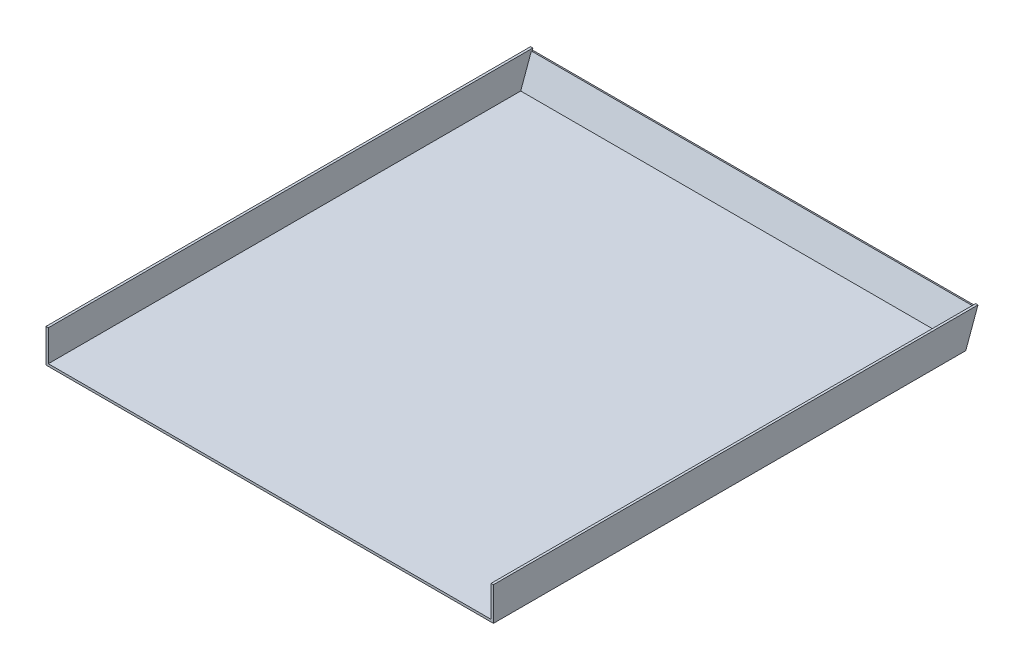
ISO-10303-21;
HEADER;
FILE_DESCRIPTION(('STEP AP214'),'2;1');
FILE_NAME('part.step','',(''),(''),'','','');
FILE_SCHEMA(('AUTOMOTIVE_DESIGN { 1 0 10303 214 1 1 1 1 }'));
ENDSEC;
DATA;
#1=APPLICATION_CONTEXT('core data for automotive mechanical design processes');
#2=APPLICATION_PROTOCOL_DEFINITION('international standard','automotive_design',2000,#1);
#3=PRODUCT_CONTEXT('',#1,'mechanical');
#4=PRODUCT('Part','Part','',(#3));
#5=PRODUCT_RELATED_PRODUCT_CATEGORY('part','',(#4));
#6=PRODUCT_DEFINITION_FORMATION('','',#4);
#7=PRODUCT_DEFINITION_CONTEXT('part definition',#1,'design');
#8=PRODUCT_DEFINITION('design','',#6,#7);
#9=PRODUCT_DEFINITION_SHAPE('','',#8);
#10=(LENGTH_UNIT() NAMED_UNIT(*) SI_UNIT(.MILLI.,.METRE.));
#11=(NAMED_UNIT(*) PLANE_ANGLE_UNIT() SI_UNIT($,.RADIAN.));
#12=(NAMED_UNIT(*) SI_UNIT($,.STERADIAN.) SOLID_ANGLE_UNIT());
#13=UNCERTAINTY_MEASURE_WITH_UNIT(LENGTH_MEASURE(1.E-05),#10,'distance_accuracy_value','');
#14=(GEOMETRIC_REPRESENTATION_CONTEXT(3) GLOBAL_UNCERTAINTY_ASSIGNED_CONTEXT((#13)) GLOBAL_UNIT_ASSIGNED_CONTEXT((#10,
#11,#12)) REPRESENTATION_CONTEXT('',''));
#15=CARTESIAN_POINT('',(0.,0.,0.));
#16=DIRECTION('',(0.,0.,1.));
#17=DIRECTION('',(1.,0.,0.));
#18=AXIS2_PLACEMENT_3D('',#15,#16,#17);
#19=CARTESIAN_POINT('',(-142.,21.5,-151.5));
#20=DIRECTION('',(-1.,0.,0.));
#21=DIRECTION('',(0.,0.,1.));
#22=AXIS2_PLACEMENT_3D('',#19,#20,#21);
#23=PLANE('',#22);
#24=DIRECTION('',(0.,0.342020143325665,0.93969262078591));
#25=VECTOR('',#24,1.);
#26=CARTESIAN_POINT('',(-142.,20.2938524157182,-158.340402866513));
#27=LINE('',#26,#25);
#28=CARTESIAN_POINT('',(-142.,20.1183857480574,-158.822493573778));
#29=VERTEX_POINT('',#28);
#30=CARTESIAN_POINT('',(-142.,20.2938524157182,-158.340402866513));
#31=VERTEX_POINT('',#30);
#32=EDGE_CURVE('E160',#29,#31,#27,.T.);
#33=ORIENTED_EDGE('',*,*,#32,.F.);
#34=DIRECTION('',(0.,0.939692620785911,-0.342020143325663));
#35=VECTOR('',#34,1.);
#36=CARTESIAN_POINT('',(-142.,21.5,-159.325360036723));
#37=LINE('',#36,#35);
#38=CARTESIAN_POINT('',(-142.,21.5,-159.325360036723));
#39=VERTEX_POINT('',#38);
#40=EDGE_CURVE('E211',#29,#39,#37,.T.);
#41=ORIENTED_EDGE('',*,*,#40,.T.);
#42=DIRECTION('',(0.,0.,-1.));
#43=VECTOR('',#42,1.);
#44=CARTESIAN_POINT('',(-142.,21.5,-151.5));
#45=LINE('',#44,#43);
#46=CARTESIAN_POINT('',(-142.,21.5,151.5));
#47=VERTEX_POINT('',#46);
#48=EDGE_CURVE('E244',#47,#39,#45,.T.);
#49=ORIENTED_EDGE('',*,*,#48,.F.);
#50=DIRECTION('',(0.,-1.,0.));
#51=VECTOR('',#50,1.);
#52=CARTESIAN_POINT('',(-142.,21.5,151.5));
#53=LINE('',#52,#51);
#54=CARTESIAN_POINT('',(-142.,1.5,151.5));
#55=VERTEX_POINT('',#54);
#56=EDGE_CURVE('E248',#47,#55,#53,.T.);
#57=ORIENTED_EDGE('',*,*,#56,.T.);
#58=DIRECTION('',(0.,0.,-1.));
#59=VECTOR('',#58,1.);
#60=CARTESIAN_POINT('',(-142.,1.5,-151.5));
#61=LINE('',#60,#59);
#62=CARTESIAN_POINT('',(-142.,1.5,-151.5));
#63=VERTEX_POINT('',#62);
#64=EDGE_CURVE('E236',#55,#63,#61,.T.);
#65=ORIENTED_EDGE('',*,*,#64,.T.);
#66=DIRECTION('',(0.,-0.93969262078591,0.342020143325665));
#67=VECTOR('',#66,1.);
#68=CARTESIAN_POINT('',(-142.,1.5,-151.5));
#69=LINE('',#68,#67);
#70=EDGE_CURVE('E55',#31,#63,#69,.T.);
#71=ORIENTED_EDGE('',*,*,#70,.F.);
#72=EDGE_LOOP('',(#33,#41,#49,#57,#65,#71));
#73=FACE_BOUND('',#72,.T.);
#74=ADVANCED_FACE('F39',(#73),#23,.F.);
#75=CARTESIAN_POINT('',(142.,21.5,-151.5));
#76=DIRECTION('',(1.,0.,0.));
#77=DIRECTION('',(0.,0.,-1.));
#78=AXIS2_PLACEMENT_3D('',#75,#76,#77);
#79=PLANE('',#78);
#80=DIRECTION('',(0.,0.342020143325665,0.93969262078591));
#81=VECTOR('',#80,1.);
#82=CARTESIAN_POINT('',(142.,20.2938524157182,-158.340402866513));
#83=LINE('',#82,#81);
#84=CARTESIAN_POINT('',(142.,20.1183857480575,-158.822493573778));
#85=VERTEX_POINT('',#84);
#86=CARTESIAN_POINT('',(142.,20.2938524157182,-158.340402866513));
#87=VERTEX_POINT('',#86);
#88=EDGE_CURVE('E63',#85,#87,#83,.T.);
#89=ORIENTED_EDGE('',*,*,#88,.T.);
#90=DIRECTION('',(0.,-0.93969262078591,0.342020143325665));
#91=VECTOR('',#90,1.);
#92=CARTESIAN_POINT('',(142.,1.5,-151.5));
#93=LINE('',#92,#91);
#94=CARTESIAN_POINT('',(142.,1.5,-151.5));
#95=VERTEX_POINT('',#94);
#96=EDGE_CURVE('E182',#87,#95,#93,.T.);
#97=ORIENTED_EDGE('',*,*,#96,.T.);
#98=DIRECTION('',(0.,0.,1.));
#99=VECTOR('',#98,1.);
#100=CARTESIAN_POINT('',(142.,1.5,-151.5));
#101=LINE('',#100,#99);
#102=CARTESIAN_POINT('',(142.,1.5,151.5));
#103=VERTEX_POINT('',#102);
#104=EDGE_CURVE('E210',#95,#103,#101,.T.);
#105=ORIENTED_EDGE('',*,*,#104,.T.);
#106=DIRECTION('',(0.,-1.,0.));
#107=VECTOR('',#106,1.);
#108=CARTESIAN_POINT('',(142.,21.5,151.5));
#109=LINE('',#108,#107);
#110=CARTESIAN_POINT('',(142.,21.5,151.5));
#111=VERTEX_POINT('',#110);
#112=EDGE_CURVE('E229',#111,#103,#109,.T.);
#113=ORIENTED_EDGE('',*,*,#112,.F.);
#114=DIRECTION('',(0.,0.,1.));
#115=VECTOR('',#114,1.);
#116=CARTESIAN_POINT('',(142.,21.5,-151.5));
#117=LINE('',#116,#115);
#118=CARTESIAN_POINT('',(142.,21.5,-159.325360036723));
#119=VERTEX_POINT('',#118);
#120=EDGE_CURVE('E222',#119,#111,#117,.T.);
#121=ORIENTED_EDGE('',*,*,#120,.F.);
#122=DIRECTION('',(0.,-0.939692620785911,0.342020143325662));
#123=VECTOR('',#122,1.);
#124=CARTESIAN_POINT('',(142.,21.5,-159.325360036723));
#125=LINE('',#124,#123);
#126=EDGE_CURVE('E191',#119,#85,#125,.T.);
#127=ORIENTED_EDGE('',*,*,#126,.T.);
#128=EDGE_LOOP('',(#89,#97,#105,#113,#121,#127));
#129=FACE_BOUND('',#128,.T.);
#130=ADVANCED_FACE('F308',(#129),#79,.F.);
#131=CARTESIAN_POINT('',(0.,1.5,0.));
#132=DIRECTION('',(0.,1.,0.));
#133=DIRECTION('',(0.,0.,1.));
#134=AXIS2_PLACEMENT_3D('',#131,#132,#133);
#135=PLANE('',#134);
#136=DIRECTION('',(1.,0.,0.));
#137=VECTOR('',#136,1.);
#138=CARTESIAN_POINT('',(-143.5,1.5,151.5));
#139=LINE('',#138,#137);
#140=EDGE_CURVE('E255',#55,#103,#139,.T.);
#141=ORIENTED_EDGE('',*,*,#140,.T.);
#142=ORIENTED_EDGE('',*,*,#104,.F.);
#143=DIRECTION('',(1.,0.,0.));
#144=VECTOR('',#143,1.);
#145=CARTESIAN_POINT('',(-143.5,1.5,-151.5));
#146=LINE('',#145,#144);
#147=EDGE_CURVE('E258',#63,#95,#146,.T.);
#148=ORIENTED_EDGE('',*,*,#147,.F.);
#149=ORIENTED_EDGE('',*,*,#64,.F.);
#150=EDGE_LOOP('',(#141,#142,#148,#149));
#151=FACE_BOUND('',#150,.T.);
#152=ADVANCED_FACE('F311',(#151),#135,.T.);
#153=CARTESIAN_POINT('',(-143.5,1.5,151.5));
#154=DIRECTION('',(0.,0.,-1.));
#155=DIRECTION('',(-1.,0.,0.));
#156=AXIS2_PLACEMENT_3D('',#153,#154,#155);
#157=PLANE('',#156);
#158=DIRECTION('',(1.,0.,0.));
#159=VECTOR('',#158,1.);
#160=CARTESIAN_POINT('',(-143.5,0.,151.5));
#161=LINE('',#160,#159);
#162=CARTESIAN_POINT('',(-143.5,0.,151.5));
#163=VERTEX_POINT('',#162);
#164=CARTESIAN_POINT('',(143.5,0.,151.5));
#165=VERTEX_POINT('',#164);
#166=EDGE_CURVE('E254',#163,#165,#161,.T.);
#167=ORIENTED_EDGE('',*,*,#166,.T.);
#168=DIRECTION('',(0.,-1.,0.));
#169=VECTOR('',#168,1.);
#170=CARTESIAN_POINT('',(143.5,1.5,151.5));
#171=LINE('',#170,#169);
#172=CARTESIAN_POINT('',(143.5,21.5,151.5));
#173=VERTEX_POINT('',#172);
#174=EDGE_CURVE('E11',#173,#165,#171,.T.);
#175=ORIENTED_EDGE('',*,*,#174,.F.);
#176=DIRECTION('',(1.,0.,0.));
#177=VECTOR('',#176,1.);
#178=CARTESIAN_POINT('',(143.5,21.5,151.5));
#179=LINE('',#178,#177);
#180=EDGE_CURVE('E225',#111,#173,#179,.T.);
#181=ORIENTED_EDGE('',*,*,#180,.F.);
#182=ORIENTED_EDGE('',*,*,#112,.T.);
#183=ORIENTED_EDGE('',*,*,#140,.F.);
#184=ORIENTED_EDGE('',*,*,#56,.F.);
#185=DIRECTION('',(1.,0.,0.));
#186=VECTOR('',#185,1.);
#187=CARTESIAN_POINT('',(-143.5,21.5,151.5));
#188=LINE('',#187,#186);
#189=CARTESIAN_POINT('',(-143.5,21.5,151.5));
#190=VERTEX_POINT('',#189);
#191=EDGE_CURVE('E241',#190,#47,#188,.T.);
#192=ORIENTED_EDGE('',*,*,#191,.F.);
#193=DIRECTION('',(0.,-1.,0.));
#194=VECTOR('',#193,1.);
#195=CARTESIAN_POINT('',(-143.5,1.5,151.5));
#196=LINE('',#195,#194);
#197=EDGE_CURVE('E48',#190,#163,#196,.T.);
#198=ORIENTED_EDGE('',*,*,#197,.T.);
#199=EDGE_LOOP('',(#167,#175,#181,#182,#183,#184,#192,#198));
#200=FACE_BOUND('',#199,.T.);
#201=ADVANCED_FACE('F41',(#200),#157,.F.);
#202=CARTESIAN_POINT('',(143.5,1.5,151.5));
#203=DIRECTION('',(-1.,0.,0.));
#204=DIRECTION('',(0.,0.,1.));
#205=AXIS2_PLACEMENT_3D('',#202,#203,#204);
#206=PLANE('',#205);
#207=DIRECTION('',(0.,0.,-1.));
#208=VECTOR('',#207,1.);
#209=CARTESIAN_POINT('',(143.5,0.,151.5));
#210=LINE('',#209,#208);
#211=CARTESIAN_POINT('',(143.5,0.,-151.5));
#212=VERTEX_POINT('',#211);
#213=EDGE_CURVE('E266',#165,#212,#210,.T.);
#214=ORIENTED_EDGE('',*,*,#213,.T.);
#215=DIRECTION('',(0.,0.939692620785911,-0.342020143325662));
#216=VECTOR('',#215,1.);
#217=CARTESIAN_POINT('',(143.5,21.5,-159.325360036723));
#218=LINE('',#217,#216);
#219=CARTESIAN_POINT('',(143.5,21.5,-159.325360036723));
#220=VERTEX_POINT('',#219);
#221=EDGE_CURVE('E176',#212,#220,#218,.T.);
#222=ORIENTED_EDGE('',*,*,#221,.T.);
#223=DIRECTION('',(0.,0.,-1.));
#224=VECTOR('',#223,1.);
#225=CARTESIAN_POINT('',(143.5,21.5,-151.5));
#226=LINE('',#225,#224);
#227=EDGE_CURVE('E219',#173,#220,#226,.T.);
#228=ORIENTED_EDGE('',*,*,#227,.F.);
#229=ORIENTED_EDGE('',*,*,#174,.T.);
#230=EDGE_LOOP('',(#214,#222,#228,#229));
#231=FACE_BOUND('',#230,.T.);
#232=ADVANCED_FACE('F340',(#231),#206,.F.);
#233=CARTESIAN_POINT('',(-143.5,1.5,151.5));
#234=DIRECTION('',(-1.,0.,0.));
#235=DIRECTION('',(0.,0.,1.));
#236=AXIS2_PLACEMENT_3D('',#233,#234,#235);
#237=PLANE('',#236);
#238=DIRECTION('',(0.,0.,-1.));
#239=VECTOR('',#238,1.);
#240=CARTESIAN_POINT('',(-143.5,0.,151.5));
#241=LINE('',#240,#239);
#242=CARTESIAN_POINT('',(-143.5,0.,-151.5));
#243=VERTEX_POINT('',#242);
#244=EDGE_CURVE('E259',#163,#243,#241,.T.);
#245=ORIENTED_EDGE('',*,*,#244,.F.);
#246=ORIENTED_EDGE('',*,*,#197,.F.);
#247=DIRECTION('',(0.,0.,1.));
#248=VECTOR('',#247,1.);
#249=CARTESIAN_POINT('',(-143.5,21.5,-151.5));
#250=LINE('',#249,#248);
#251=CARTESIAN_POINT('',(-143.5,21.5,-159.325360036723));
#252=VERTEX_POINT('',#251);
#253=EDGE_CURVE('E237',#252,#190,#250,.T.);
#254=ORIENTED_EDGE('',*,*,#253,.F.);
#255=DIRECTION('',(0.,-0.93969262078591,0.342020143325663));
#256=VECTOR('',#255,1.);
#257=CARTESIAN_POINT('',(-143.5,21.5,-159.325360036723));
#258=LINE('',#257,#256);
#259=EDGE_CURVE('E194',#252,#243,#258,.T.);
#260=ORIENTED_EDGE('',*,*,#259,.T.);
#261=EDGE_LOOP('',(#245,#246,#254,#260));
#262=FACE_BOUND('',#261,.T.);
#263=ADVANCED_FACE('F284',(#262),#237,.T.);
#264=CARTESIAN_POINT('',(0.,0.,0.));
#265=DIRECTION('',(0.,1.,0.));
#266=DIRECTION('',(0.,0.,1.));
#267=AXIS2_PLACEMENT_3D('',#264,#265,#266);
#268=PLANE('',#267);
#269=ORIENTED_EDGE('',*,*,#166,.F.);
#270=ORIENTED_EDGE('',*,*,#244,.T.);
#271=DIRECTION('',(1.,0.,0.));
#272=VECTOR('',#271,1.);
#273=CARTESIAN_POINT('',(-143.5,0.,-151.5));
#274=LINE('',#273,#272);
#275=CARTESIAN_POINT('',(-142.,0.,-151.5));
#276=VERTEX_POINT('',#275);
#277=EDGE_CURVE('E270',#243,#276,#274,.T.);
#278=ORIENTED_EDGE('',*,*,#277,.T.);
#279=CARTESIAN_POINT('',(142.,0.,-151.5));
#280=VERTEX_POINT('',#279);
#281=EDGE_CURVE('E164',#276,#280,#274,.T.);
#282=ORIENTED_EDGE('',*,*,#281,.T.);
#283=DIRECTION('',(1.,0.,0.));
#284=VECTOR('',#283,1.);
#285=CARTESIAN_POINT('',(119.120177891768,0.,-151.5));
#286=LINE('',#285,#284);
#287=EDGE_CURVE('E200',#280,#212,#286,.T.);
#288=ORIENTED_EDGE('',*,*,#287,.T.);
#289=ORIENTED_EDGE('',*,*,#213,.F.);
#290=EDGE_LOOP('',(#269,#270,#278,#282,#288,#289));
#291=FACE_BOUND('',#290,.T.);
#292=ADVANCED_FACE('F282',(#291),#268,.F.);
#293=CARTESIAN_POINT('',(0.,21.5,0.));
#294=DIRECTION('',(0.,1.,0.));
#295=DIRECTION('',(0.,0.,1.));
#296=AXIS2_PLACEMENT_3D('',#293,#294,#295);
#297=PLANE('',#296);
#298=ORIENTED_EDGE('',*,*,#253,.T.);
#299=ORIENTED_EDGE('',*,*,#191,.T.);
#300=ORIENTED_EDGE('',*,*,#48,.T.);
#301=DIRECTION('',(-1.,0.,0.));
#302=VECTOR('',#301,1.);
#303=CARTESIAN_POINT('',(-119.120177891768,21.5,-159.325360036723));
#304=LINE('',#303,#302);
#305=EDGE_CURVE('E215',#39,#252,#304,.T.);
#306=ORIENTED_EDGE('',*,*,#305,.T.);
#307=EDGE_LOOP('',(#298,#299,#300,#306));
#308=FACE_BOUND('',#307,.T.);
#309=ADVANCED_FACE('F316',(#308),#297,.T.);
#310=CARTESIAN_POINT('',(0.,21.5,0.));
#311=DIRECTION('',(0.,-1.,0.));
#312=DIRECTION('',(0.,0.,-1.));
#313=AXIS2_PLACEMENT_3D('',#310,#311,#312);
#314=PLANE('',#313);
#315=ORIENTED_EDGE('',*,*,#227,.T.);
#316=DIRECTION('',(1.,0.,0.));
#317=VECTOR('',#316,1.);
#318=CARTESIAN_POINT('',(119.120177891768,21.5,-159.325360036723));
#319=LINE('',#318,#317);
#320=EDGE_CURVE('E199',#119,#220,#319,.T.);
#321=ORIENTED_EDGE('',*,*,#320,.F.);
#322=ORIENTED_EDGE('',*,*,#120,.T.);
#323=ORIENTED_EDGE('',*,*,#180,.T.);
#324=EDGE_LOOP('',(#315,#321,#322,#323));
#325=FACE_BOUND('',#324,.T.);
#326=ADVANCED_FACE('F318',(#325),#314,.F.);
#327=CARTESIAN_POINT('',(-119.120177891768,21.5,-159.325360036723));
#328=DIRECTION('',(0.,-0.342020143325663,-0.93969262078591));
#329=DIRECTION('',(0.,0.939692620785911,-0.342020143325663));
#330=AXIS2_PLACEMENT_3D('',#327,#328,#329);
#331=PLANE('',#330);
#332=EDGE_CURVE('E207',#276,#29,#37,.T.);
#333=ORIENTED_EDGE('',*,*,#332,.F.);
#334=ORIENTED_EDGE('',*,*,#277,.F.);
#335=ORIENTED_EDGE('',*,*,#259,.F.);
#336=ORIENTED_EDGE('',*,*,#305,.F.);
#337=ORIENTED_EDGE('',*,*,#40,.F.);
#338=EDGE_LOOP('',(#333,#334,#335,#336,#337));
#339=FACE_BOUND('',#338,.T.);
#340=ADVANCED_FACE('F289',(#339),#331,.T.);
#341=CARTESIAN_POINT('',(119.120177891768,21.5,-159.325360036723));
#342=DIRECTION('',(0.,-0.342020143325662,-0.939692620785911));
#343=DIRECTION('',(0.,0.939692620785911,-0.342020143325662));
#344=AXIS2_PLACEMENT_3D('',#341,#342,#343);
#345=PLANE('',#344);
#346=ORIENTED_EDGE('',*,*,#126,.F.);
#347=ORIENTED_EDGE('',*,*,#320,.T.);
#348=ORIENTED_EDGE('',*,*,#221,.F.);
#349=ORIENTED_EDGE('',*,*,#287,.F.);
#350=EDGE_CURVE('E195',#85,#280,#125,.T.);
#351=ORIENTED_EDGE('',*,*,#350,.F.);
#352=EDGE_LOOP('',(#346,#347,#348,#349,#351));
#353=FACE_BOUND('',#352,.T.);
#354=ADVANCED_FACE('F296',(#353),#345,.T.);
#355=CARTESIAN_POINT('',(163.90666532214,1.5,-151.5));
#356=DIRECTION('',(-1.,0.,0.));
#357=DIRECTION('',(0.,0.,1.));
#358=AXIS2_PLACEMENT_3D('',#355,#356,#357);
#359=CYLINDRICAL_SURFACE('',#358,1.50000000000001);
#360=CARTESIAN_POINT('',(142.,1.5,-151.5));
#361=DIRECTION('',(1.,0.,0.));
#362=DIRECTION('',(0.,0.,-1.));
#363=AXIS2_PLACEMENT_3D('',#360,#361,#362);
#364=CIRCLE('',#363,1.50000000000001);
#365=CARTESIAN_POINT('',(142.,0.986969785011504,-152.909538931179));
#366=VERTEX_POINT('',#365);
#367=EDGE_CURVE('E179',#280,#366,#364,.T.);
#368=ORIENTED_EDGE('',*,*,#367,.F.);
#369=ORIENTED_EDGE('',*,*,#281,.F.);
#370=CARTESIAN_POINT('',(-142.,1.5,-151.5));
#371=DIRECTION('',(-1.,0.,0.));
#372=DIRECTION('',(0.,0.,1.));
#373=AXIS2_PLACEMENT_3D('',#370,#371,#372);
#374=CIRCLE('',#373,1.50000000000001);
#375=CARTESIAN_POINT('',(-142.,0.986969785011504,-152.909538931179));
#376=VERTEX_POINT('',#375);
#377=EDGE_CURVE('E156',#276,#376,#374,.F.);
#378=ORIENTED_EDGE('',*,*,#377,.T.);
#379=DIRECTION('',(-1.,0.,0.));
#380=VECTOR('',#379,1.);
#381=CARTESIAN_POINT('',(163.90666532214,0.986969785011504,-152.909538931179));
#382=LINE('',#381,#380);
#383=EDGE_CURVE('E137',#366,#376,#382,.T.);
#384=ORIENTED_EDGE('',*,*,#383,.F.);
#385=EDGE_LOOP('',(#368,#369,#378,#384));
#386=FACE_BOUND('',#385,.T.);
#387=ADVANCED_FACE('F163',(#386),#359,.T.);
#388=CARTESIAN_POINT('',(163.90666532214,19.7808222007297,-159.749941797692));
#389=DIRECTION('',(0.,0.342020143325665,0.93969262078591));
#390=DIRECTION('',(0.,-0.93969262078591,0.342020143325665));
#391=AXIS2_PLACEMENT_3D('',#388,#389,#390);
#392=PLANE('',#391);
#393=DIRECTION('',(0.,0.93969262078591,-0.342020143325665));
#394=VECTOR('',#393,1.);
#395=CARTESIAN_POINT('',(142.,19.7808222007297,-159.749941797692));
#396=LINE('',#395,#394);
#397=CARTESIAN_POINT('',(142.,19.7808222007297,-159.749941797692));
#398=VERTEX_POINT('',#397);
#399=EDGE_CURVE('E143',#366,#398,#396,.T.);
#400=ORIENTED_EDGE('',*,*,#399,.F.);
#401=ORIENTED_EDGE('',*,*,#383,.T.);
#402=DIRECTION('',(0.,0.93969262078591,-0.342020143325665));
#403=VECTOR('',#402,1.);
#404=CARTESIAN_POINT('',(-142.,19.7808222007297,-159.749941797692));
#405=LINE('',#404,#403);
#406=CARTESIAN_POINT('',(-142.,19.7808222007297,-159.749941797692));
#407=VERTEX_POINT('',#406);
#408=EDGE_CURVE('E141',#376,#407,#405,.T.);
#409=ORIENTED_EDGE('',*,*,#408,.T.);
#410=DIRECTION('',(-1.,0.,0.));
#411=VECTOR('',#410,1.);
#412=CARTESIAN_POINT('',(163.90666532214,19.7808222007297,-159.749941797692));
#413=LINE('',#412,#411);
#414=EDGE_CURVE('E149',#398,#407,#413,.T.);
#415=ORIENTED_EDGE('',*,*,#414,.F.);
#416=EDGE_LOOP('',(#400,#401,#409,#415));
#417=FACE_BOUND('',#416,.T.);
#418=ADVANCED_FACE('F139',(#417),#392,.F.);
#419=CARTESIAN_POINT('',(163.90666532214,20.2938524157182,-158.340402866513));
#420=DIRECTION('',(0.,-0.93969262078591,0.342020143325665));
#421=DIRECTION('',(0.,-0.342020143325665,-0.93969262078591));
#422=AXIS2_PLACEMENT_3D('',#419,#420,#421);
#423=PLANE('',#422);
#424=EDGE_CURVE('E172',#398,#85,#83,.T.);
#425=ORIENTED_EDGE('',*,*,#424,.F.);
#426=ORIENTED_EDGE('',*,*,#414,.T.);
#427=EDGE_CURVE('E158',#407,#29,#27,.T.);
#428=ORIENTED_EDGE('',*,*,#427,.T.);
#429=ORIENTED_EDGE('',*,*,#32,.T.);
#430=DIRECTION('',(-1.,0.,0.));
#431=VECTOR('',#430,1.);
#432=CARTESIAN_POINT('',(163.90666532214,20.2938524157182,-158.340402866513));
#433=LINE('',#432,#431);
#434=EDGE_CURVE('E184',#87,#31,#433,.T.);
#435=ORIENTED_EDGE('',*,*,#434,.F.);
#436=ORIENTED_EDGE('',*,*,#88,.F.);
#437=EDGE_LOOP('',(#425,#426,#428,#429,#435,#436));
#438=FACE_BOUND('',#437,.T.);
#439=ADVANCED_FACE('F303',(#438),#423,.F.);
#440=CARTESIAN_POINT('',(163.90666532214,1.5,-151.5));
#441=DIRECTION('',(0.,-0.342020143325665,-0.93969262078591));
#442=DIRECTION('',(0.,0.93969262078591,-0.342020143325665));
#443=AXIS2_PLACEMENT_3D('',#440,#441,#442);
#444=PLANE('',#443);
#445=ORIENTED_EDGE('',*,*,#96,.F.);
#446=ORIENTED_EDGE('',*,*,#434,.T.);
#447=ORIENTED_EDGE('',*,*,#70,.T.);
#448=ORIENTED_EDGE('',*,*,#147,.T.);
#449=EDGE_LOOP('',(#445,#446,#447,#448));
#450=FACE_BOUND('',#449,.T.);
#451=ADVANCED_FACE('F306',(#450),#444,.F.);
#452=CARTESIAN_POINT('',(142.,21.5,-151.5));
#453=DIRECTION('',(1.,0.,0.));
#454=DIRECTION('',(0.,0.,-1.));
#455=AXIS2_PLACEMENT_3D('',#452,#453,#454);
#456=PLANE('',#455);
#457=ORIENTED_EDGE('',*,*,#424,.T.);
#458=ORIENTED_EDGE('',*,*,#350,.T.);
#459=ORIENTED_EDGE('',*,*,#367,.T.);
#460=ORIENTED_EDGE('',*,*,#399,.T.);
#461=EDGE_LOOP('',(#457,#458,#459,#460));
#462=FACE_BOUND('',#461,.T.);
#463=ADVANCED_FACE('F298',(#462),#456,.T.);
#464=CARTESIAN_POINT('',(-142.,21.5,-151.5));
#465=DIRECTION('',(-1.,0.,0.));
#466=DIRECTION('',(0.,0.,1.));
#467=AXIS2_PLACEMENT_3D('',#464,#465,#466);
#468=PLANE('',#467);
#469=ORIENTED_EDGE('',*,*,#377,.F.);
#470=ORIENTED_EDGE('',*,*,#332,.T.);
#471=ORIENTED_EDGE('',*,*,#427,.F.);
#472=ORIENTED_EDGE('',*,*,#408,.F.);
#473=EDGE_LOOP('',(#469,#470,#471,#472));
#474=FACE_BOUND('',#473,.T.);
#475=ADVANCED_FACE('F154',(#474),#468,.T.);
#476=CLOSED_SHELL('',(#74,#130,#152,#201,#232,#263,#292,#309,#326,#340,#354,#387,#418,#439,#451,
#463,#475));
#477=MANIFOLD_SOLID_BREP('B2',#476);
#478=ADVANCED_BREP_SHAPE_REPRESENTATION('',(#18,#477),#14);
#479=SHAPE_DEFINITION_REPRESENTATION(#9,#478);
ENDSEC;
END-ISO-10303-21;
